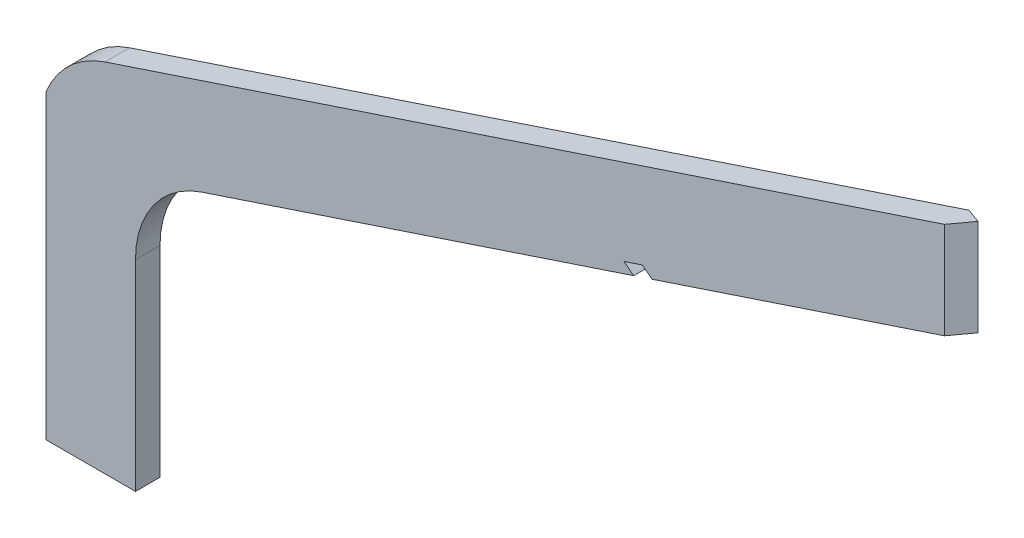
ISO-10303-21;
HEADER;
FILE_DESCRIPTION(('STEP AP214'),'2;1');
FILE_NAME('part.step','',(''),(''),'','','');
FILE_SCHEMA(('AUTOMOTIVE_DESIGN { 1 0 10303 214 1 1 1 1 }'));
ENDSEC;
DATA;
#1=APPLICATION_CONTEXT('core data for automotive mechanical design processes');
#2=APPLICATION_PROTOCOL_DEFINITION('international standard','automotive_design',2000,#1);
#3=PRODUCT_CONTEXT('',#1,'mechanical');
#4=PRODUCT('Part','Part','',(#3));
#5=PRODUCT_RELATED_PRODUCT_CATEGORY('part','',(#4));
#6=PRODUCT_DEFINITION_FORMATION('','',#4);
#7=PRODUCT_DEFINITION_CONTEXT('part definition',#1,'design');
#8=PRODUCT_DEFINITION('design','',#6,#7);
#9=PRODUCT_DEFINITION_SHAPE('','',#8);
#10=(LENGTH_UNIT() NAMED_UNIT(*) SI_UNIT(.MILLI.,.METRE.));
#11=(NAMED_UNIT(*) PLANE_ANGLE_UNIT() SI_UNIT($,.RADIAN.));
#12=(NAMED_UNIT(*) SI_UNIT($,.STERADIAN.) SOLID_ANGLE_UNIT());
#13=UNCERTAINTY_MEASURE_WITH_UNIT(LENGTH_MEASURE(1.E-05),#10,'distance_accuracy_value','');
#14=(GEOMETRIC_REPRESENTATION_CONTEXT(3) GLOBAL_UNCERTAINTY_ASSIGNED_CONTEXT((#13)) GLOBAL_UNIT_ASSIGNED_CONTEXT((#10,
#11,#12)) REPRESENTATION_CONTEXT('',''));
#15=CARTESIAN_POINT('',(0.,0.,0.));
#16=DIRECTION('',(0.,0.,1.));
#17=DIRECTION('',(1.,0.,0.));
#18=AXIS2_PLACEMENT_3D('',#15,#16,#17);
#19=CARTESIAN_POINT('',(-95.4802918979404,-64.0182857808747,-3.175));
#20=DIRECTION('',(0.,0.,-1.));
#21=DIRECTION('',(-1.,0.,0.));
#22=AXIS2_PLACEMENT_3D('',#19,#20,#21);
#23=PLANE('',#22);
#24=DIRECTION('',(0.94892708856625,0.315495452558639,0.));
#25=VECTOR('',#24,1.);
#26=CARTESIAN_POINT('',(-78.3676782119062,-56.9832093607602,-3.175));
#27=LINE('',#26,#25);
#28=CARTESIAN_POINT('',(38.2910947397079,-18.196970870177,-3.175));
#29=VERTEX_POINT('',#28);
#30=CARTESIAN_POINT('',(114.020446788028,6.98121877614899,-3.17500000000002));
#31=VERTEX_POINT('',#30);
#32=EDGE_CURVE('E163',#29,#31,#27,.T.);
#33=ORIENTED_EDGE('',*,*,#32,.F.);
#34=DIRECTION('',(0.794130517429638,-0.607747251155393,0.));
#35=VECTOR('',#34,1.);
#36=CARTESIAN_POINT('',(35.7697303468695,-16.2673733477591,-3.175));
#37=LINE('',#36,#35);
#38=CARTESIAN_POINT('',(35.7697303468695,-16.2673733477591,-3.175));
#39=VERTEX_POINT('',#38);
#40=EDGE_CURVE('E147',#39,#29,#37,.T.);
#41=ORIENTED_EDGE('',*,*,#40,.F.);
#42=DIRECTION('',(0.948927088566251,0.315495452558637,0.));
#43=VECTOR('',#42,1.);
#44=CARTESIAN_POINT('',(31.0250949040383,-17.8448506105523,-3.175));
#45=LINE('',#44,#43);
#46=CARTESIAN_POINT('',(31.0250949040383,-17.8448506105523,-3.175));
#47=VERTEX_POINT('',#46);
#48=EDGE_CURVE('E158',#47,#39,#45,.T.);
#49=ORIENTED_EDGE('',*,*,#48,.F.);
#50=DIRECTION('',(-0.794130517429636,0.607747251155395,0.));
#51=VECTOR('',#50,1.);
#52=CARTESIAN_POINT('',(33.5464592968767,-19.7744481329702,-3.175));
#53=LINE('',#52,#51);
#54=CARTESIAN_POINT('',(33.5464592968767,-19.7744481329702,-3.175));
#55=VERTEX_POINT('',#54);
#56=EDGE_CURVE('E296',#55,#47,#53,.T.);
#57=ORIENTED_EDGE('',*,*,#56,.F.);
#58=CARTESIAN_POINT('',(-78.3676782119062,-56.9832093607602,-3.175));
#59=VERTEX_POINT('',#58);
#60=EDGE_CURVE('E173',#59,#55,#27,.T.);
#61=ORIENTED_EDGE('',*,*,#60,.F.);
#62=CARTESIAN_POINT('',(-70.4802918979404,-80.7063865749165,-3.175));
#63=DIRECTION('',(0.,0.,-1.));
#64=DIRECTION('',(-1.,0.,0.));
#65=AXIS2_PLACEMENT_3D('',#62,#63,#64);
#66=CIRCLE('',#65,25.);
#67=CARTESIAN_POINT('',(-95.4802918979404,-80.7063865749167,-3.175));
#68=VERTEX_POINT('',#67);
#69=EDGE_CURVE('E197',#68,#59,#66,.T.);
#70=ORIENTED_EDGE('',*,*,#69,.F.);
#71=DIRECTION('',(0.,1.,0.));
#72=VECTOR('',#71,1.);
#73=CARTESIAN_POINT('',(-95.4802918979404,-132.672742165113,-3.175));
#74=LINE('',#73,#72);
#75=CARTESIAN_POINT('',(-95.4802918979404,-132.672742165113,-3.175));
#76=VERTEX_POINT('',#75);
#77=EDGE_CURVE('E194',#76,#68,#74,.T.);
#78=ORIENTED_EDGE('',*,*,#77,.F.);
#79=DIRECTION('',(1.,0.,0.));
#80=VECTOR('',#79,1.);
#81=CARTESIAN_POINT('',(-120.48029189794,-132.672742165113,-3.175));
#82=LINE('',#81,#80);
#83=CARTESIAN_POINT('',(-118.647204793263,-132.672742165113,-3.175));
#84=VERTEX_POINT('',#83);
#85=EDGE_CURVE('E191',#84,#76,#82,.T.);
#86=ORIENTED_EDGE('',*,*,#85,.F.);
#87=DIRECTION('',(0.,-1.,0.));
#88=VECTOR('',#87,1.);
#89=CARTESIAN_POINT('',(-118.647204793263,33.8095910061271,-3.175));
#90=LINE('',#89,#88);
#91=CARTESIAN_POINT('',(-118.647204793263,-54.6217892582063,-3.175));
#92=VERTEX_POINT('',#91);
#93=EDGE_CURVE('E259',#92,#84,#90,.T.);
#94=ORIENTED_EDGE('',*,*,#93,.F.);
#95=CARTESIAN_POINT('',(-95.4802918979404,-64.0182857808747,-3.175));
#96=DIRECTION('',(0.,0.,-1.));
#97=DIRECTION('',(-1.,0.,0.));
#98=AXIS2_PLACEMENT_3D('',#95,#96,#97);
#99=CIRCLE('',#98,25.);
#100=CARTESIAN_POINT('',(-103.367678211906,-40.2951085667184,-3.175));
#101=VERTEX_POINT('',#100);
#102=EDGE_CURVE('E187',#92,#101,#99,.T.);
#103=ORIENTED_EDGE('',*,*,#102,.T.);
#104=DIRECTION('',(-0.94892708856625,-0.315495452558639,0.));
#105=VECTOR('',#104,1.);
#106=CARTESIAN_POINT('',(119.51970810206,33.8095910061271,-3.175));
#107=LINE('',#106,#105);
#108=CARTESIAN_POINT('',(114.020446788028,31.981218776149,-3.175));
#109=VERTEX_POINT('',#108);
#110=EDGE_CURVE('E179',#109,#101,#107,.T.);
#111=ORIENTED_EDGE('',*,*,#110,.F.);
#112=DIRECTION('',(0.,-1.,0.));
#113=VECTOR('',#112,1.);
#114=CARTESIAN_POINT('',(114.020446788028,33.8095910061271,-3.175));
#115=LINE('',#114,#113);
#116=EDGE_CURVE('E171',#109,#31,#115,.T.);
#117=ORIENTED_EDGE('',*,*,#116,.T.);
#118=EDGE_LOOP('',(#33,#41,#49,#57,#61,#70,#78,#86,#94,#103,#111,#117));
#119=FACE_BOUND('',#118,.T.);
#120=ADVANCED_FACE('F43',(#119),#23,.T.);
#121=CARTESIAN_POINT('',(-78.3676782119062,-56.9832093607602,-3.175));
#122=DIRECTION('',(0.315495452558639,-0.94892708856625,0.));
#123=DIRECTION('',(0.94892708856625,0.315495452558639,0.));
#124=AXIS2_PLACEMENT_3D('',#121,#122,#123);
#125=PLANE('',#124);
#126=DIRECTION('',(0.94892708856625,0.315495452558639,0.));
#127=VECTOR('',#126,1.);
#128=CARTESIAN_POINT('',(-78.3676782119062,-56.9832093607602,3.175));
#129=LINE('',#128,#127);
#130=CARTESIAN_POINT('',(38.2910947397079,-18.196970870177,3.175));
#131=VERTEX_POINT('',#130);
#132=CARTESIAN_POINT('',(114.020446788028,6.981218776149,3.175));
#133=VERTEX_POINT('',#132);
#134=EDGE_CURVE('E166',#131,#133,#129,.T.);
#135=ORIENTED_EDGE('',*,*,#134,.F.);
#136=DIRECTION('',(0.,0.,1.));
#137=VECTOR('',#136,1.);
#138=CARTESIAN_POINT('',(38.2910947397079,-18.196970870177,-11.2431055496947));
#139=LINE('',#138,#137);
#140=EDGE_CURVE('E151',#29,#131,#139,.T.);
#141=ORIENTED_EDGE('',*,*,#140,.F.);
#142=ORIENTED_EDGE('',*,*,#32,.T.);
#143=DIRECTION('',(0.83221475542026,0.276691406590572,0.480479413065458));
#144=VECTOR('',#143,1.);
#145=CARTESIAN_POINT('',(-33.9528659485,-42.2163516493608,-88.607431941314));
#146=LINE('',#145,#144);
#147=CARTESIAN_POINT('',(119.51970810206,8.80959100612712,0.));
#148=VERTEX_POINT('',#147);
#149=EDGE_CURVE('E274',#31,#148,#146,.T.);
#150=ORIENTED_EDGE('',*,*,#149,.T.);
#151=DIRECTION('',(0.83221475542026,0.276691406590572,-0.480479413065458));
#152=VECTOR('',#151,1.);
#153=CARTESIAN_POINT('',(-31.4137418850976,-41.3721539179038,87.1414679798028));
#154=LINE('',#153,#152);
#155=EDGE_CURVE('E265',#133,#148,#154,.T.);
#156=ORIENTED_EDGE('',*,*,#155,.F.);
#157=EDGE_LOOP('',(#135,#141,#142,#150,#156));
#158=FACE_BOUND('',#157,.T.);
#159=ADVANCED_FACE('F45',(#158),#125,.T.);
#160=ORIENTED_EDGE('',*,*,#60,.T.);
#161=DIRECTION('',(0.,0.,1.));
#162=VECTOR('',#161,1.);
#163=CARTESIAN_POINT('',(33.5464592968767,-19.7744481329702,-11.2431055496947));
#164=LINE('',#163,#162);
#165=CARTESIAN_POINT('',(33.5464592968767,-19.7744481329702,3.175));
#166=VERTEX_POINT('',#165);
#167=EDGE_CURVE('E284',#55,#166,#164,.T.);
#168=ORIENTED_EDGE('',*,*,#167,.T.);
#169=CARTESIAN_POINT('',(-78.3676782119062,-56.9832093607602,3.175));
#170=VERTEX_POINT('',#169);
#171=EDGE_CURVE('E243',#170,#166,#129,.T.);
#172=ORIENTED_EDGE('',*,*,#171,.F.);
#173=DIRECTION('',(0.,0.,1.));
#174=VECTOR('',#173,1.);
#175=CARTESIAN_POINT('',(-78.3676782119062,-56.9832093607602,-3.175));
#176=LINE('',#175,#174);
#177=EDGE_CURVE('E202',#59,#170,#176,.T.);
#178=ORIENTED_EDGE('',*,*,#177,.F.);
#179=EDGE_LOOP('',(#160,#168,#172,#178));
#180=FACE_BOUND('',#179,.T.);
#181=ADVANCED_FACE('F310',(#180),#125,.T.);
#182=CARTESIAN_POINT('',(-95.4802918979404,-64.0182857808747,3.175));
#183=DIRECTION('',(0.,0.,-1.));
#184=DIRECTION('',(-1.,0.,0.));
#185=AXIS2_PLACEMENT_3D('',#182,#183,#184);
#186=PLANE('',#185);
#187=DIRECTION('',(0.794130517429638,-0.607747251155393,0.));
#188=VECTOR('',#187,1.);
#189=CARTESIAN_POINT('',(35.7697303468695,-16.2673733477591,3.175));
#190=LINE('',#189,#188);
#191=CARTESIAN_POINT('',(35.7697303468695,-16.2673733477591,3.175));
#192=VERTEX_POINT('',#191);
#193=EDGE_CURVE('E290',#192,#131,#190,.T.);
#194=ORIENTED_EDGE('',*,*,#193,.T.);
#195=ORIENTED_EDGE('',*,*,#134,.T.);
#196=DIRECTION('',(0.,1.,0.));
#197=VECTOR('',#196,1.);
#198=CARTESIAN_POINT('',(114.020446788028,-64.0182857808747,3.175));
#199=LINE('',#198,#197);
#200=CARTESIAN_POINT('',(114.020446788028,31.981218776149,3.175));
#201=VERTEX_POINT('',#200);
#202=EDGE_CURVE('E11',#133,#201,#199,.T.);
#203=ORIENTED_EDGE('',*,*,#202,.T.);
#204=DIRECTION('',(-0.94892708856625,-0.315495452558639,0.));
#205=VECTOR('',#204,1.);
#206=CARTESIAN_POINT('',(119.51970810206,33.8095910061271,3.175));
#207=LINE('',#206,#205);
#208=CARTESIAN_POINT('',(-103.367678211906,-40.2951085667184,3.175));
#209=VERTEX_POINT('',#208);
#210=EDGE_CURVE('E238',#201,#209,#207,.T.);
#211=ORIENTED_EDGE('',*,*,#210,.T.);
#212=CARTESIAN_POINT('',(-95.4802918979404,-64.0182857808747,3.175));
#213=DIRECTION('',(0.,0.,-1.));
#214=DIRECTION('',(-1.,0.,0.));
#215=AXIS2_PLACEMENT_3D('',#212,#213,#214);
#216=CIRCLE('',#215,25.);
#217=CARTESIAN_POINT('',(-118.647204793263,-54.6217892582063,3.175));
#218=VERTEX_POINT('',#217);
#219=EDGE_CURVE('E223',#218,#209,#216,.T.);
#220=ORIENTED_EDGE('',*,*,#219,.F.);
#221=DIRECTION('',(0.,-1.,0.));
#222=VECTOR('',#221,1.);
#223=CARTESIAN_POINT('',(-118.647204793263,-64.0182857808747,3.175));
#224=LINE('',#223,#222);
#225=CARTESIAN_POINT('',(-118.647204793263,-132.672742165113,3.175));
#226=VERTEX_POINT('',#225);
#227=EDGE_CURVE('E52',#218,#226,#224,.T.);
#228=ORIENTED_EDGE('',*,*,#227,.T.);
#229=DIRECTION('',(1.,0.,0.));
#230=VECTOR('',#229,1.);
#231=CARTESIAN_POINT('',(-120.48029189794,-132.672742165113,3.175));
#232=LINE('',#231,#230);
#233=CARTESIAN_POINT('',(-95.4802918979404,-132.672742165113,3.175));
#234=VERTEX_POINT('',#233);
#235=EDGE_CURVE('E221',#226,#234,#232,.T.);
#236=ORIENTED_EDGE('',*,*,#235,.T.);
#237=DIRECTION('',(0.,1.,0.));
#238=VECTOR('',#237,1.);
#239=CARTESIAN_POINT('',(-95.4802918979404,-132.672742165113,3.175));
#240=LINE('',#239,#238);
#241=CARTESIAN_POINT('',(-95.4802918979404,-80.7063865749167,3.175));
#242=VERTEX_POINT('',#241);
#243=EDGE_CURVE('E181',#234,#242,#240,.T.);
#244=ORIENTED_EDGE('',*,*,#243,.T.);
#245=CARTESIAN_POINT('',(-70.4802918979404,-80.7063865749165,3.175));
#246=DIRECTION('',(0.,0.,-1.));
#247=DIRECTION('',(-1.,0.,0.));
#248=AXIS2_PLACEMENT_3D('',#245,#246,#247);
#249=CIRCLE('',#248,25.);
#250=EDGE_CURVE('E174',#242,#170,#249,.T.);
#251=ORIENTED_EDGE('',*,*,#250,.T.);
#252=ORIENTED_EDGE('',*,*,#171,.T.);
#253=DIRECTION('',(-0.794130517429636,0.607747251155395,0.));
#254=VECTOR('',#253,1.);
#255=CARTESIAN_POINT('',(33.5464592968767,-19.7744481329702,3.175));
#256=LINE('',#255,#254);
#257=CARTESIAN_POINT('',(31.0250949040383,-17.8448506105523,3.175));
#258=VERTEX_POINT('',#257);
#259=EDGE_CURVE('E283',#166,#258,#256,.T.);
#260=ORIENTED_EDGE('',*,*,#259,.T.);
#261=DIRECTION('',(0.948927088566251,0.315495452558637,0.));
#262=VECTOR('',#261,1.);
#263=CARTESIAN_POINT('',(31.0250949040383,-17.8448506105523,3.175));
#264=LINE('',#263,#262);
#265=EDGE_CURVE('E59',#258,#192,#264,.T.);
#266=ORIENTED_EDGE('',*,*,#265,.T.);
#267=EDGE_LOOP('',(#194,#195,#203,#211,#220,#228,#236,#244,#251,#252,#260,#266));
#268=FACE_BOUND('',#267,.T.);
#269=ADVANCED_FACE('F219',(#268),#186,.F.);
#270=CARTESIAN_POINT('',(119.51970810206,33.8095910061271,-3.175));
#271=DIRECTION('',(-0.315495452558639,0.94892708856625,0.));
#272=DIRECTION('',(-0.94892708856625,-0.315495452558639,0.));
#273=AXIS2_PLACEMENT_3D('',#270,#271,#272);
#274=PLANE('',#273);
#275=DIRECTION('',(-0.83221475542026,-0.276691406590572,0.480479413065458));
#276=VECTOR('',#275,1.);
#277=CARTESIAN_POINT('',(120.789270133761,34.2316898718556,-0.732981980755634));
#278=LINE('',#277,#276);
#279=CARTESIAN_POINT('',(119.51970810206,33.8095910061271,0.));
#280=VERTEX_POINT('',#279);
#281=EDGE_CURVE('E67',#280,#201,#278,.T.);
#282=ORIENTED_EDGE('',*,*,#281,.F.);
#283=DIRECTION('',(-0.83221475542026,-0.276691406590572,-0.480479413065458));
#284=VECTOR('',#283,1.);
#285=CARTESIAN_POINT('',(118.250146070358,33.3874921403986,-0.732981980755634));
#286=LINE('',#285,#284);
#287=EDGE_CURVE('E277',#280,#109,#286,.T.);
#288=ORIENTED_EDGE('',*,*,#287,.T.);
#289=ORIENTED_EDGE('',*,*,#110,.T.);
#290=DIRECTION('',(0.,0.,1.));
#291=VECTOR('',#290,1.);
#292=CARTESIAN_POINT('',(-103.367678211906,-40.2951085667184,-3.175));
#293=LINE('',#292,#291);
#294=EDGE_CURVE('E201',#101,#209,#293,.T.);
#295=ORIENTED_EDGE('',*,*,#294,.T.);
#296=ORIENTED_EDGE('',*,*,#210,.F.);
#297=EDGE_LOOP('',(#282,#288,#289,#295,#296));
#298=FACE_BOUND('',#297,.T.);
#299=ADVANCED_FACE('F331',(#298),#274,.T.);
#300=CARTESIAN_POINT('',(-120.48029189794,-132.672742165113,-3.175));
#301=DIRECTION('',(0.,-1.,0.));
#302=DIRECTION('',(0.,0.,-1.));
#303=AXIS2_PLACEMENT_3D('',#300,#301,#302);
#304=PLANE('',#303);
#305=DIRECTION('',(0.499999999999999,0.,0.866025403784439));
#306=VECTOR('',#305,1.);
#307=CARTESIAN_POINT('',(-120.48029189794,-132.672742165113,0.));
#308=LINE('',#307,#306);
#309=CARTESIAN_POINT('',(-120.48029189794,-132.672742165113,0.));
#310=VERTEX_POINT('',#309);
#311=EDGE_CURVE('E231',#310,#226,#308,.T.);
#312=ORIENTED_EDGE('',*,*,#311,.F.);
#313=DIRECTION('',(0.499999999999999,0.,-0.866025403784439));
#314=VECTOR('',#313,1.);
#315=CARTESIAN_POINT('',(-120.48029189794,-132.672742165113,0.));
#316=LINE('',#315,#314);
#317=EDGE_CURVE('E262',#310,#84,#316,.T.);
#318=ORIENTED_EDGE('',*,*,#317,.T.);
#319=ORIENTED_EDGE('',*,*,#85,.T.);
#320=DIRECTION('',(0.,0.,1.));
#321=VECTOR('',#320,1.);
#322=CARTESIAN_POINT('',(-95.4802918979404,-132.672742165113,-3.175));
#323=LINE('',#322,#321);
#324=EDGE_CURVE('E208',#76,#234,#323,.T.);
#325=ORIENTED_EDGE('',*,*,#324,.T.);
#326=ORIENTED_EDGE('',*,*,#235,.F.);
#327=EDGE_LOOP('',(#312,#318,#319,#325,#326));
#328=FACE_BOUND('',#327,.T.);
#329=ADVANCED_FACE('F229',(#328),#304,.T.);
#330=CARTESIAN_POINT('',(-95.4802918979404,-64.0182857808747,-3.175));
#331=DIRECTION('',(0.,0.,1.));
#332=DIRECTION('',(1.,0.,0.));
#333=AXIS2_PLACEMENT_3D('',#330,#331,#332);
#334=CYLINDRICAL_SURFACE('',#333,25.);
#335=CARTESIAN_POINT('',(-95.4802918979404,-64.0182857808747,-43.3012701892221));
#336=DIRECTION('',(-0.866025403784439,0.,-0.499999999999999));
#337=DIRECTION('',(-0.499999999999999,0.,0.86602540378444));
#338=AXIS2_PLACEMENT_3D('',#335,#336,#337);
#339=ELLIPSE('',#338,50.0000000000001,25.);
#340=CARTESIAN_POINT('',(-120.48029189794,-64.0182857808747,0.));
#341=VERTEX_POINT('',#340);
#342=EDGE_CURVE('E256',#341,#92,#339,.T.);
#343=ORIENTED_EDGE('',*,*,#342,.F.);
#344=CARTESIAN_POINT('',(-95.4802918979404,-64.0182857808747,43.3012701892221));
#345=DIRECTION('',(0.866025403784439,0.,-0.499999999999999));
#346=DIRECTION('',(0.499999999999999,0.,0.86602540378444));
#347=AXIS2_PLACEMENT_3D('',#344,#345,#346);
#348=ELLIPSE('',#347,50.0000000000001,25.);
#349=EDGE_CURVE('E247',#341,#218,#348,.T.);
#350=ORIENTED_EDGE('',*,*,#349,.T.);
#351=ORIENTED_EDGE('',*,*,#219,.T.);
#352=ORIENTED_EDGE('',*,*,#294,.F.);
#353=ORIENTED_EDGE('',*,*,#102,.F.);
#354=EDGE_LOOP('',(#343,#350,#351,#352,#353));
#355=FACE_BOUND('',#354,.T.);
#356=ADVANCED_FACE('F328',(#355),#334,.T.);
#357=CARTESIAN_POINT('',(-70.4802918979404,-80.7063865749165,-3.175));
#358=DIRECTION('',(0.,0.,1.));
#359=DIRECTION('',(1.,0.,0.));
#360=AXIS2_PLACEMENT_3D('',#357,#358,#359);
#361=CYLINDRICAL_SURFACE('',#360,25.);
#362=ORIENTED_EDGE('',*,*,#177,.T.);
#363=ORIENTED_EDGE('',*,*,#250,.F.);
#364=DIRECTION('',(0.,0.,1.));
#365=VECTOR('',#364,1.);
#366=CARTESIAN_POINT('',(-95.4802918979404,-80.7063865749167,-3.175));
#367=LINE('',#366,#365);
#368=EDGE_CURVE('E205',#68,#242,#367,.T.);
#369=ORIENTED_EDGE('',*,*,#368,.F.);
#370=ORIENTED_EDGE('',*,*,#69,.T.);
#371=EDGE_LOOP('',(#362,#363,#369,#370));
#372=FACE_BOUND('',#371,.T.);
#373=ADVANCED_FACE('F316',(#372),#361,.F.);
#374=CARTESIAN_POINT('',(-95.4802918979404,-80.7063865749167,-3.175));
#375=DIRECTION('',(-1.,0.,0.));
#376=DIRECTION('',(0.,0.,1.));
#377=AXIS2_PLACEMENT_3D('',#374,#375,#376);
#378=PLANE('',#377);
#379=ORIENTED_EDGE('',*,*,#368,.T.);
#380=ORIENTED_EDGE('',*,*,#243,.F.);
#381=ORIENTED_EDGE('',*,*,#324,.F.);
#382=ORIENTED_EDGE('',*,*,#77,.T.);
#383=EDGE_LOOP('',(#379,#380,#381,#382));
#384=FACE_BOUND('',#383,.T.);
#385=ADVANCED_FACE('F319',(#384),#378,.F.);
#386=CARTESIAN_POINT('',(-120.48029189794,33.8095910061271,0.));
#387=DIRECTION('',(0.866025403784439,0.,-0.499999999999999));
#388=DIRECTION('',(-0.499999999999999,0.,-0.86602540378444));
#389=AXIS2_PLACEMENT_3D('',#386,#387,#388);
#390=PLANE('',#389);
#391=DIRECTION('',(0.,-1.,0.));
#392=VECTOR('',#391,1.);
#393=CARTESIAN_POINT('',(-120.48029189794,33.8095910061271,0.));
#394=LINE('',#393,#392);
#395=EDGE_CURVE('E250',#341,#310,#394,.T.);
#396=ORIENTED_EDGE('',*,*,#395,.T.);
#397=ORIENTED_EDGE('',*,*,#311,.T.);
#398=ORIENTED_EDGE('',*,*,#227,.F.);
#399=ORIENTED_EDGE('',*,*,#349,.F.);
#400=EDGE_LOOP('',(#396,#397,#398,#399));
#401=FACE_BOUND('',#400,.T.);
#402=ADVANCED_FACE('F326',(#401),#390,.F.);
#403=CARTESIAN_POINT('',(-120.48029189794,33.8095910061271,0.));
#404=DIRECTION('',(-0.866025403784439,0.,-0.499999999999999));
#405=DIRECTION('',(-0.499999999999999,0.,0.86602540378444));
#406=AXIS2_PLACEMENT_3D('',#403,#404,#405);
#407=PLANE('',#406);
#408=ORIENTED_EDGE('',*,*,#342,.T.);
#409=ORIENTED_EDGE('',*,*,#93,.T.);
#410=ORIENTED_EDGE('',*,*,#317,.F.);
#411=ORIENTED_EDGE('',*,*,#395,.F.);
#412=EDGE_LOOP('',(#408,#409,#410,#411));
#413=FACE_BOUND('',#412,.T.);
#414=ADVANCED_FACE('F324',(#413),#407,.T.);
#415=CARTESIAN_POINT('',(119.51970810206,33.8095910061271,0.));
#416=DIRECTION('',(-0.499999999999994,0.,-0.866025403784442));
#417=DIRECTION('',(-0.866025403784442,0.,0.499999999999994));
#418=AXIS2_PLACEMENT_3D('',#415,#416,#417);
#419=PLANE('',#418);
#420=ORIENTED_EDGE('',*,*,#155,.T.);
#421=DIRECTION('',(0.,-1.,0.));
#422=VECTOR('',#421,1.);
#423=CARTESIAN_POINT('',(119.51970810206,33.8095910061271,0.));
#424=LINE('',#423,#422);
#425=EDGE_CURVE('E271',#280,#148,#424,.T.);
#426=ORIENTED_EDGE('',*,*,#425,.F.);
#427=ORIENTED_EDGE('',*,*,#281,.T.);
#428=ORIENTED_EDGE('',*,*,#202,.F.);
#429=EDGE_LOOP('',(#420,#426,#427,#428));
#430=FACE_BOUND('',#429,.T.);
#431=ADVANCED_FACE('F335',(#430),#419,.F.);
#432=CARTESIAN_POINT('',(119.51970810206,33.8095910061271,0.));
#433=DIRECTION('',(0.499999999999994,0.,-0.866025403784442));
#434=DIRECTION('',(-0.866025403784442,0.,-0.499999999999994));
#435=AXIS2_PLACEMENT_3D('',#432,#433,#434);
#436=PLANE('',#435);
#437=ORIENTED_EDGE('',*,*,#116,.F.);
#438=ORIENTED_EDGE('',*,*,#287,.F.);
#439=ORIENTED_EDGE('',*,*,#425,.T.);
#440=ORIENTED_EDGE('',*,*,#149,.F.);
#441=EDGE_LOOP('',(#437,#438,#439,#440));
#442=FACE_BOUND('',#441,.T.);
#443=ADVANCED_FACE('F334',(#442),#436,.T.);
#444=CARTESIAN_POINT('',(35.7697303468695,-16.2673733477591,-11.2431055496947));
#445=DIRECTION('',(-0.607747251155393,-0.794130517429638,0.));
#446=DIRECTION('',(0.794130517429638,-0.607747251155393,0.));
#447=AXIS2_PLACEMENT_3D('',#444,#445,#446);
#448=PLANE('',#447);
#449=ORIENTED_EDGE('',*,*,#40,.T.);
#450=ORIENTED_EDGE('',*,*,#140,.T.);
#451=ORIENTED_EDGE('',*,*,#193,.F.);
#452=DIRECTION('',(0.,0.,1.));
#453=VECTOR('',#452,1.);
#454=CARTESIAN_POINT('',(35.7697303468695,-16.2673733477591,-11.2431055496947));
#455=LINE('',#454,#453);
#456=EDGE_CURVE('E153',#39,#192,#455,.T.);
#457=ORIENTED_EDGE('',*,*,#456,.F.);
#458=EDGE_LOOP('',(#449,#450,#451,#457));
#459=FACE_BOUND('',#458,.T.);
#460=ADVANCED_FACE('F149',(#459),#448,.T.);
#461=CARTESIAN_POINT('',(31.0250949040383,-17.8448506105523,-11.2431055496947));
#462=DIRECTION('',(0.315495452558637,-0.948927088566251,0.));
#463=DIRECTION('',(0.948927088566251,0.315495452558637,0.));
#464=AXIS2_PLACEMENT_3D('',#461,#462,#463);
#465=PLANE('',#464);
#466=ORIENTED_EDGE('',*,*,#48,.T.);
#467=ORIENTED_EDGE('',*,*,#456,.T.);
#468=ORIENTED_EDGE('',*,*,#265,.F.);
#469=DIRECTION('',(0.,0.,1.));
#470=VECTOR('',#469,1.);
#471=CARTESIAN_POINT('',(31.0250949040383,-17.8448506105523,-11.2431055496947));
#472=LINE('',#471,#470);
#473=EDGE_CURVE('E291',#47,#258,#472,.T.);
#474=ORIENTED_EDGE('',*,*,#473,.F.);
#475=EDGE_LOOP('',(#466,#467,#468,#474));
#476=FACE_BOUND('',#475,.T.);
#477=ADVANCED_FACE('F470',(#476),#465,.T.);
#478=CARTESIAN_POINT('',(33.5464592968767,-19.7744481329702,-11.2431055496947));
#479=DIRECTION('',(0.607747251155395,0.794130517429636,0.));
#480=DIRECTION('',(-0.794130517429636,0.607747251155395,0.));
#481=AXIS2_PLACEMENT_3D('',#478,#479,#480);
#482=PLANE('',#481);
#483=ORIENTED_EDGE('',*,*,#56,.T.);
#484=ORIENTED_EDGE('',*,*,#473,.T.);
#485=ORIENTED_EDGE('',*,*,#259,.F.);
#486=ORIENTED_EDGE('',*,*,#167,.F.);
#487=EDGE_LOOP('',(#483,#484,#485,#486));
#488=FACE_BOUND('',#487,.T.);
#489=ADVANCED_FACE('F307',(#488),#482,.T.);
#490=CLOSED_SHELL('',(#120,#159,#181,#269,#299,#329,#356,#373,#385,#402,#414,#431,#443,#460,
#477,#489));
#491=MANIFOLD_SOLID_BREP('B2',#490);
#492=ADVANCED_BREP_SHAPE_REPRESENTATION('',(#18,#491),#14);
#493=SHAPE_DEFINITION_REPRESENTATION(#9,#492);
ENDSEC;
END-ISO-10303-21;
